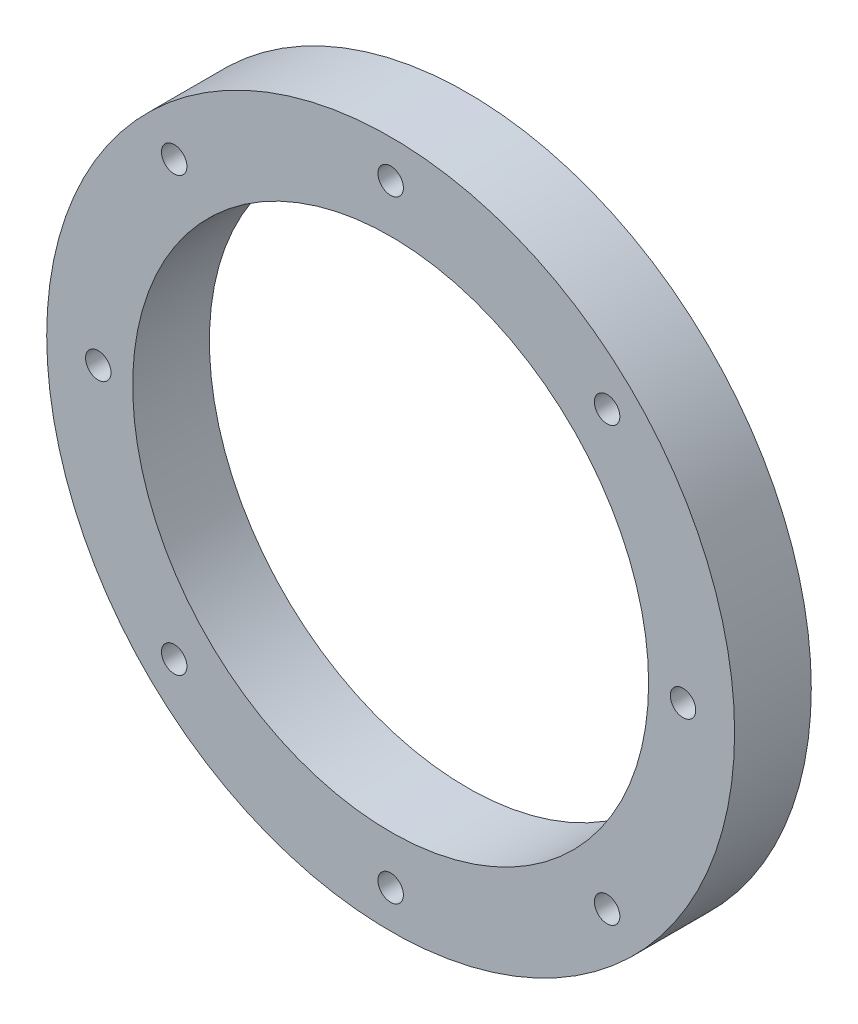
ISO-10303-21;
HEADER;
FILE_DESCRIPTION(('STEP AP214'),'2;1');
FILE_NAME('part.step','',(''),(''),'','','');
FILE_SCHEMA(('AUTOMOTIVE_DESIGN { 1 0 10303 214 1 1 1 1 }'));
ENDSEC;
DATA;
#1=APPLICATION_CONTEXT('core data for automotive mechanical design processes');
#2=APPLICATION_PROTOCOL_DEFINITION('international standard','automotive_design',2000,#1);
#3=PRODUCT_CONTEXT('',#1,'mechanical');
#4=PRODUCT('Part','Part','',(#3));
#5=PRODUCT_RELATED_PRODUCT_CATEGORY('part','',(#4));
#6=PRODUCT_DEFINITION_FORMATION('','',#4);
#7=PRODUCT_DEFINITION_CONTEXT('part definition',#1,'design');
#8=PRODUCT_DEFINITION('design','',#6,#7);
#9=PRODUCT_DEFINITION_SHAPE('','',#8);
#10=(LENGTH_UNIT() NAMED_UNIT(*) SI_UNIT(.MILLI.,.METRE.));
#11=(NAMED_UNIT(*) PLANE_ANGLE_UNIT() SI_UNIT($,.RADIAN.));
#12=(NAMED_UNIT(*) SI_UNIT($,.STERADIAN.) SOLID_ANGLE_UNIT());
#13=UNCERTAINTY_MEASURE_WITH_UNIT(LENGTH_MEASURE(1.E-05),#10,'distance_accuracy_value','');
#14=(GEOMETRIC_REPRESENTATION_CONTEXT(3) GLOBAL_UNCERTAINTY_ASSIGNED_CONTEXT((#13)) GLOBAL_UNIT_ASSIGNED_CONTEXT((#10,
#11,#12)) REPRESENTATION_CONTEXT('',''));
#15=CARTESIAN_POINT('',(0.,0.,0.));
#16=DIRECTION('',(0.,0.,1.));
#17=DIRECTION('',(1.,0.,0.));
#18=AXIS2_PLACEMENT_3D('',#15,#16,#17);
#19=CARTESIAN_POINT('',(0.,0.,-11.15));
#20=DIRECTION('',(0.,0.,1.));
#21=DIRECTION('',(-1.,0.,0.));
#22=AXIS2_PLACEMENT_3D('',#19,#20,#21);
#23=CYLINDRICAL_SURFACE('',#22,37.5);
#24=CARTESIAN_POINT('',(0.,0.,-11.15));
#25=DIRECTION('',(0.,0.,1.));
#26=DIRECTION('',(1.,0.,0.));
#27=AXIS2_PLACEMENT_3D('',#24,#25,#26);
#28=CIRCLE('',#27,37.5);
#29=CARTESIAN_POINT('',(37.5,0.,-11.15));
#30=VERTEX_POINT('',#29);
#31=EDGE_CURVE('E56',#30,#30,#28,.T.);
#32=ORIENTED_EDGE('',*,*,#31,.F.);
#33=EDGE_LOOP('',(#32));
#34=FACE_BOUND('',#33,.T.);
#35=CARTESIAN_POINT('',(0.,0.,0.));
#36=DIRECTION('',(0.,0.,1.));
#37=DIRECTION('',(1.,0.,0.));
#38=AXIS2_PLACEMENT_3D('',#35,#36,#37);
#39=CIRCLE('',#38,37.5);
#40=CARTESIAN_POINT('',(37.5,0.,0.));
#41=VERTEX_POINT('',#40);
#42=EDGE_CURVE('E97',#41,#41,#39,.T.);
#43=ORIENTED_EDGE('',*,*,#42,.T.);
#44=EDGE_LOOP('',(#43));
#45=FACE_BOUND('',#44,.T.);
#46=ADVANCED_FACE('F47',(#34,#45),#23,.F.);
#47=CARTESIAN_POINT('',(0.,44.5,-11.15));
#48=DIRECTION('',(0.,0.,1.));
#49=DIRECTION('',(-1.,0.,0.));
#50=AXIS2_PLACEMENT_3D('',#47,#48,#49);
#51=CYLINDRICAL_SURFACE('',#50,1.85);
#52=CARTESIAN_POINT('',(0.,44.5,-11.15));
#53=DIRECTION('',(0.,0.,1.));
#54=DIRECTION('',(1.,0.,0.));
#55=AXIS2_PLACEMENT_3D('',#52,#53,#54);
#56=CIRCLE('',#55,1.85);
#57=CARTESIAN_POINT('',(1.85,44.5,-11.15));
#58=VERTEX_POINT('',#57);
#59=EDGE_CURVE('E62',#58,#58,#56,.T.);
#60=ORIENTED_EDGE('',*,*,#59,.F.);
#61=EDGE_LOOP('',(#60));
#62=FACE_BOUND('',#61,.T.);
#63=CARTESIAN_POINT('',(0.,44.5,0.));
#64=DIRECTION('',(0.,0.,1.));
#65=DIRECTION('',(1.,0.,0.));
#66=AXIS2_PLACEMENT_3D('',#63,#64,#65);
#67=CIRCLE('',#66,1.85);
#68=CARTESIAN_POINT('',(1.85,44.5,0.));
#69=VERTEX_POINT('',#68);
#70=EDGE_CURVE('E94',#69,#69,#67,.T.);
#71=ORIENTED_EDGE('',*,*,#70,.T.);
#72=EDGE_LOOP('',(#71));
#73=FACE_BOUND('',#72,.T.);
#74=ADVANCED_FACE('F143',(#62,#73),#51,.F.);
#75=CARTESIAN_POINT('',(31.4662517628014,31.4662517628014,-11.15));
#76=DIRECTION('',(0.,0.,1.));
#77=DIRECTION('',(-1.,0.,0.));
#78=AXIS2_PLACEMENT_3D('',#75,#76,#77);
#79=CYLINDRICAL_SURFACE('',#78,1.85);
#80=CARTESIAN_POINT('',(31.4662517628014,31.4662517628014,-11.15));
#81=DIRECTION('',(0.,0.,1.));
#82=DIRECTION('',(1.,0.,0.));
#83=AXIS2_PLACEMENT_3D('',#80,#81,#82);
#84=CIRCLE('',#83,1.85);
#85=CARTESIAN_POINT('',(33.3162517628014,31.4662517628014,-11.15));
#86=VERTEX_POINT('',#85);
#87=EDGE_CURVE('E133',#86,#86,#84,.T.);
#88=ORIENTED_EDGE('',*,*,#87,.F.);
#89=EDGE_LOOP('',(#88));
#90=FACE_BOUND('',#89,.T.);
#91=CARTESIAN_POINT('',(31.4662517628014,31.4662517628014,0.));
#92=DIRECTION('',(0.,0.,1.));
#93=DIRECTION('',(1.,0.,0.));
#94=AXIS2_PLACEMENT_3D('',#91,#92,#93);
#95=CIRCLE('',#94,1.85);
#96=CARTESIAN_POINT('',(33.3162517628014,31.4662517628014,0.));
#97=VERTEX_POINT('',#96);
#98=EDGE_CURVE('E90',#97,#97,#95,.T.);
#99=ORIENTED_EDGE('',*,*,#98,.T.);
#100=EDGE_LOOP('',(#99));
#101=FACE_BOUND('',#100,.T.);
#102=ADVANCED_FACE('F146',(#90,#101),#79,.F.);
#103=CARTESIAN_POINT('',(42.5,0.,-11.15));
#104=DIRECTION('',(0.,0.,1.));
#105=DIRECTION('',(-1.,0.,0.));
#106=AXIS2_PLACEMENT_3D('',#103,#104,#105);
#107=CYLINDRICAL_SURFACE('',#106,1.85);
#108=CARTESIAN_POINT('',(42.5,0.,-11.15));
#109=DIRECTION('',(0.,0.,1.));
#110=DIRECTION('',(1.,0.,0.));
#111=AXIS2_PLACEMENT_3D('',#108,#109,#110);
#112=CIRCLE('',#111,1.85);
#113=CARTESIAN_POINT('',(44.35,0.,-11.15));
#114=VERTEX_POINT('',#113);
#115=EDGE_CURVE('E129',#114,#114,#112,.T.);
#116=ORIENTED_EDGE('',*,*,#115,.F.);
#117=EDGE_LOOP('',(#116));
#118=FACE_BOUND('',#117,.T.);
#119=CARTESIAN_POINT('',(42.5,0.,0.));
#120=DIRECTION('',(0.,0.,1.));
#121=DIRECTION('',(1.,0.,0.));
#122=AXIS2_PLACEMENT_3D('',#119,#120,#121);
#123=CIRCLE('',#122,1.85);
#124=CARTESIAN_POINT('',(44.35,0.,0.));
#125=VERTEX_POINT('',#124);
#126=EDGE_CURVE('E86',#125,#125,#123,.T.);
#127=ORIENTED_EDGE('',*,*,#126,.T.);
#128=EDGE_LOOP('',(#127));
#129=FACE_BOUND('',#128,.T.);
#130=ADVANCED_FACE('F172',(#118,#129),#107,.F.);
#131=CARTESIAN_POINT('',(31.4662517628014,-31.4662517628014,-11.15));
#132=DIRECTION('',(0.,0.,1.));
#133=DIRECTION('',(-1.,0.,0.));
#134=AXIS2_PLACEMENT_3D('',#131,#132,#133);
#135=CYLINDRICAL_SURFACE('',#134,1.85);
#136=CARTESIAN_POINT('',(31.4662517628014,-31.4662517628014,-11.15));
#137=DIRECTION('',(0.,0.,1.));
#138=DIRECTION('',(1.,0.,0.));
#139=AXIS2_PLACEMENT_3D('',#136,#137,#138);
#140=CIRCLE('',#139,1.85);
#141=CARTESIAN_POINT('',(33.3162517628014,-31.4662517628014,-11.15));
#142=VERTEX_POINT('',#141);
#143=EDGE_CURVE('E125',#142,#142,#140,.T.);
#144=ORIENTED_EDGE('',*,*,#143,.F.);
#145=EDGE_LOOP('',(#144));
#146=FACE_BOUND('',#145,.T.);
#147=CARTESIAN_POINT('',(31.4662517628014,-31.4662517628014,0.));
#148=DIRECTION('',(0.,0.,1.));
#149=DIRECTION('',(1.,0.,0.));
#150=AXIS2_PLACEMENT_3D('',#147,#148,#149);
#151=CIRCLE('',#150,1.85);
#152=CARTESIAN_POINT('',(33.3162517628014,-31.4662517628014,0.));
#153=VERTEX_POINT('',#152);
#154=EDGE_CURVE('E82',#153,#153,#151,.T.);
#155=ORIENTED_EDGE('',*,*,#154,.T.);
#156=EDGE_LOOP('',(#155));
#157=FACE_BOUND('',#156,.T.);
#158=ADVANCED_FACE('F176',(#146,#157),#135,.F.);
#159=CARTESIAN_POINT('',(0.,-44.5,-11.15));
#160=DIRECTION('',(0.,0.,1.));
#161=DIRECTION('',(-1.,0.,0.));
#162=AXIS2_PLACEMENT_3D('',#159,#160,#161);
#163=CYLINDRICAL_SURFACE('',#162,1.85);
#164=CARTESIAN_POINT('',(0.,-44.5,-11.15));
#165=DIRECTION('',(0.,0.,1.));
#166=DIRECTION('',(1.,0.,0.));
#167=AXIS2_PLACEMENT_3D('',#164,#165,#166);
#168=CIRCLE('',#167,1.85);
#169=CARTESIAN_POINT('',(1.85,-44.5,-11.15));
#170=VERTEX_POINT('',#169);
#171=EDGE_CURVE('E121',#170,#170,#168,.T.);
#172=ORIENTED_EDGE('',*,*,#171,.F.);
#173=EDGE_LOOP('',(#172));
#174=FACE_BOUND('',#173,.T.);
#175=CARTESIAN_POINT('',(0.,-44.5,0.));
#176=DIRECTION('',(0.,0.,1.));
#177=DIRECTION('',(1.,0.,0.));
#178=AXIS2_PLACEMENT_3D('',#175,#176,#177);
#179=CIRCLE('',#178,1.85);
#180=CARTESIAN_POINT('',(1.85,-44.5,0.));
#181=VERTEX_POINT('',#180);
#182=EDGE_CURVE('E78',#181,#181,#179,.T.);
#183=ORIENTED_EDGE('',*,*,#182,.T.);
#184=EDGE_LOOP('',(#183));
#185=FACE_BOUND('',#184,.T.);
#186=ADVANCED_FACE('F180',(#174,#185),#163,.F.);
#187=CARTESIAN_POINT('',(-31.4662517628014,-31.4662517628014,-11.15));
#188=DIRECTION('',(0.,0.,1.));
#189=DIRECTION('',(-1.,0.,0.));
#190=AXIS2_PLACEMENT_3D('',#187,#188,#189);
#191=CYLINDRICAL_SURFACE('',#190,1.85);
#192=CARTESIAN_POINT('',(-31.4662517628014,-31.4662517628014,-11.15));
#193=DIRECTION('',(0.,0.,1.));
#194=DIRECTION('',(1.,0.,0.));
#195=AXIS2_PLACEMENT_3D('',#192,#193,#194);
#196=CIRCLE('',#195,1.85);
#197=CARTESIAN_POINT('',(-29.6162517628014,-31.4662517628014,-11.15));
#198=VERTEX_POINT('',#197);
#199=EDGE_CURVE('E115',#198,#198,#196,.T.);
#200=ORIENTED_EDGE('',*,*,#199,.F.);
#201=EDGE_LOOP('',(#200));
#202=FACE_BOUND('',#201,.T.);
#203=CARTESIAN_POINT('',(-31.4662517628014,-31.4662517628014,0.));
#204=DIRECTION('',(0.,0.,1.));
#205=DIRECTION('',(1.,0.,0.));
#206=AXIS2_PLACEMENT_3D('',#203,#204,#205);
#207=CIRCLE('',#206,1.85);
#208=CARTESIAN_POINT('',(-29.6162517628014,-31.4662517628014,0.));
#209=VERTEX_POINT('',#208);
#210=EDGE_CURVE('E74',#209,#209,#207,.T.);
#211=ORIENTED_EDGE('',*,*,#210,.T.);
#212=EDGE_LOOP('',(#211));
#213=FACE_BOUND('',#212,.T.);
#214=ADVANCED_FACE('F184',(#202,#213),#191,.F.);
#215=CARTESIAN_POINT('',(-42.5,0.,-11.15));
#216=DIRECTION('',(0.,0.,1.));
#217=DIRECTION('',(-1.,0.,0.));
#218=AXIS2_PLACEMENT_3D('',#215,#216,#217);
#219=CYLINDRICAL_SURFACE('',#218,1.85);
#220=CARTESIAN_POINT('',(-42.5,0.,-11.15));
#221=DIRECTION('',(0.,0.,1.));
#222=DIRECTION('',(1.,0.,0.));
#223=AXIS2_PLACEMENT_3D('',#220,#221,#222);
#224=CIRCLE('',#223,1.85);
#225=CARTESIAN_POINT('',(-40.65,0.,-11.15));
#226=VERTEX_POINT('',#225);
#227=EDGE_CURVE('E109',#226,#226,#224,.T.);
#228=ORIENTED_EDGE('',*,*,#227,.F.);
#229=EDGE_LOOP('',(#228));
#230=FACE_BOUND('',#229,.T.);
#231=CARTESIAN_POINT('',(-42.5,0.,0.));
#232=DIRECTION('',(0.,0.,1.));
#233=DIRECTION('',(1.,0.,0.));
#234=AXIS2_PLACEMENT_3D('',#231,#232,#233);
#235=CIRCLE('',#234,1.85);
#236=CARTESIAN_POINT('',(-40.65,0.,0.));
#237=VERTEX_POINT('',#236);
#238=EDGE_CURVE('E70',#237,#237,#235,.T.);
#239=ORIENTED_EDGE('',*,*,#238,.T.);
#240=EDGE_LOOP('',(#239));
#241=FACE_BOUND('',#240,.T.);
#242=ADVANCED_FACE('F187',(#230,#241),#219,.F.);
#243=CARTESIAN_POINT('',(-31.4662517628014,31.4662517628014,-11.15));
#244=DIRECTION('',(0.,0.,1.));
#245=DIRECTION('',(-1.,0.,0.));
#246=AXIS2_PLACEMENT_3D('',#243,#244,#245);
#247=CYLINDRICAL_SURFACE('',#246,1.85);
#248=CARTESIAN_POINT('',(-31.4662517628014,31.4662517628014,-11.15));
#249=DIRECTION('',(0.,0.,1.));
#250=DIRECTION('',(1.,0.,0.));
#251=AXIS2_PLACEMENT_3D('',#248,#249,#250);
#252=CIRCLE('',#251,1.85);
#253=CARTESIAN_POINT('',(-29.6162517628014,31.4662517628014,-11.15));
#254=VERTEX_POINT('',#253);
#255=EDGE_CURVE('E104',#254,#254,#252,.T.);
#256=ORIENTED_EDGE('',*,*,#255,.F.);
#257=EDGE_LOOP('',(#256));
#258=FACE_BOUND('',#257,.T.);
#259=CARTESIAN_POINT('',(-31.4662517628014,31.4662517628014,0.));
#260=DIRECTION('',(0.,0.,1.));
#261=DIRECTION('',(1.,0.,0.));
#262=AXIS2_PLACEMENT_3D('',#259,#260,#261);
#263=CIRCLE('',#262,1.85);
#264=CARTESIAN_POINT('',(-29.6162517628014,31.4662517628014,0.));
#265=VERTEX_POINT('',#264);
#266=EDGE_CURVE('E66',#265,#265,#263,.T.);
#267=ORIENTED_EDGE('',*,*,#266,.T.);
#268=EDGE_LOOP('',(#267));
#269=FACE_BOUND('',#268,.T.);
#270=ADVANCED_FACE('F49',(#258,#269),#247,.F.);
#271=CARTESIAN_POINT('',(0.,0.,-11.15));
#272=DIRECTION('',(0.,0.,1.));
#273=DIRECTION('',(-1.,0.,0.));
#274=AXIS2_PLACEMENT_3D('',#271,#272,#273);
#275=CYLINDRICAL_SURFACE('',#274,50.);
#276=CARTESIAN_POINT('',(0.,0.,-11.15));
#277=DIRECTION('',(0.,0.,1.));
#278=DIRECTION('',(1.,0.,0.));
#279=AXIS2_PLACEMENT_3D('',#276,#277,#278);
#280=CIRCLE('',#279,50.);
#281=CARTESIAN_POINT('',(50.,0.,-11.15));
#282=VERTEX_POINT('',#281);
#283=EDGE_CURVE('E10',#282,#282,#280,.T.);
#284=ORIENTED_EDGE('',*,*,#283,.T.);
#285=EDGE_LOOP('',(#284));
#286=FACE_BOUND('',#285,.T.);
#287=CARTESIAN_POINT('',(0.,0.,0.));
#288=DIRECTION('',(0.,0.,1.));
#289=DIRECTION('',(1.,0.,0.));
#290=AXIS2_PLACEMENT_3D('',#287,#288,#289);
#291=CIRCLE('',#290,50.);
#292=CARTESIAN_POINT('',(50.,0.,0.));
#293=VERTEX_POINT('',#292);
#294=EDGE_CURVE('E51',#293,#293,#291,.T.);
#295=ORIENTED_EDGE('',*,*,#294,.F.);
#296=EDGE_LOOP('',(#295));
#297=FACE_BOUND('',#296,.T.);
#298=ADVANCED_FACE('F158',(#286,#297),#275,.T.);
#299=CARTESIAN_POINT('',(0.,0.,-11.15));
#300=DIRECTION('',(0.,0.,-1.));
#301=DIRECTION('',(1.,0.,0.));
#302=AXIS2_PLACEMENT_3D('',#299,#300,#301);
#303=PLANE('',#302);
#304=ORIENTED_EDGE('',*,*,#255,.T.);
#305=EDGE_LOOP('',(#304));
#306=FACE_BOUND('',#305,.T.);
#307=ORIENTED_EDGE('',*,*,#227,.T.);
#308=EDGE_LOOP('',(#307));
#309=FACE_BOUND('',#308,.T.);
#310=ORIENTED_EDGE('',*,*,#199,.T.);
#311=EDGE_LOOP('',(#310));
#312=FACE_BOUND('',#311,.T.);
#313=ORIENTED_EDGE('',*,*,#171,.T.);
#314=EDGE_LOOP('',(#313));
#315=FACE_BOUND('',#314,.T.);
#316=ORIENTED_EDGE('',*,*,#143,.T.);
#317=EDGE_LOOP('',(#316));
#318=FACE_BOUND('',#317,.T.);
#319=ORIENTED_EDGE('',*,*,#115,.T.);
#320=EDGE_LOOP('',(#319));
#321=FACE_BOUND('',#320,.T.);
#322=ORIENTED_EDGE('',*,*,#87,.T.);
#323=EDGE_LOOP('',(#322));
#324=FACE_BOUND('',#323,.T.);
#325=ORIENTED_EDGE('',*,*,#59,.T.);
#326=EDGE_LOOP('',(#325));
#327=FACE_BOUND('',#326,.T.);
#328=ORIENTED_EDGE('',*,*,#31,.T.);
#329=EDGE_LOOP('',(#328));
#330=FACE_BOUND('',#329,.T.);
#331=ORIENTED_EDGE('',*,*,#283,.F.);
#332=EDGE_LOOP('',(#331));
#333=FACE_BOUND('',#332,.T.);
#334=ADVANCED_FACE('F140',(#306,#309,#312,#315,#318,#321,#324,#327,#330,#333),#303,.T.);
#335=CARTESIAN_POINT('',(0.,0.,0.));
#336=DIRECTION('',(0.,0.,-1.));
#337=DIRECTION('',(1.,0.,0.));
#338=AXIS2_PLACEMENT_3D('',#335,#336,#337);
#339=PLANE('',#338);
#340=ORIENTED_EDGE('',*,*,#266,.F.);
#341=EDGE_LOOP('',(#340));
#342=FACE_BOUND('',#341,.T.);
#343=ORIENTED_EDGE('',*,*,#238,.F.);
#344=EDGE_LOOP('',(#343));
#345=FACE_BOUND('',#344,.T.);
#346=ORIENTED_EDGE('',*,*,#210,.F.);
#347=EDGE_LOOP('',(#346));
#348=FACE_BOUND('',#347,.T.);
#349=ORIENTED_EDGE('',*,*,#182,.F.);
#350=EDGE_LOOP('',(#349));
#351=FACE_BOUND('',#350,.T.);
#352=ORIENTED_EDGE('',*,*,#154,.F.);
#353=EDGE_LOOP('',(#352));
#354=FACE_BOUND('',#353,.T.);
#355=ORIENTED_EDGE('',*,*,#126,.F.);
#356=EDGE_LOOP('',(#355));
#357=FACE_BOUND('',#356,.T.);
#358=ORIENTED_EDGE('',*,*,#98,.F.);
#359=EDGE_LOOP('',(#358));
#360=FACE_BOUND('',#359,.T.);
#361=ORIENTED_EDGE('',*,*,#70,.F.);
#362=EDGE_LOOP('',(#361));
#363=FACE_BOUND('',#362,.T.);
#364=ORIENTED_EDGE('',*,*,#42,.F.);
#365=EDGE_LOOP('',(#364));
#366=FACE_BOUND('',#365,.T.);
#367=ORIENTED_EDGE('',*,*,#294,.T.);
#368=EDGE_LOOP('',(#367));
#369=FACE_BOUND('',#368,.T.);
#370=ADVANCED_FACE('F150',(#342,#345,#348,#351,#354,#357,#360,#363,#366,#369),#339,.F.);
#371=CLOSED_SHELL('',(#46,#74,#102,#130,#158,#186,#214,#242,#270,#298,#334,#370));
#372=MANIFOLD_SOLID_BREP('B2',#371);
#373=ADVANCED_BREP_SHAPE_REPRESENTATION('',(#18,#372),#14);
#374=SHAPE_DEFINITION_REPRESENTATION(#9,#373);
ENDSEC;
END-ISO-10303-21;
